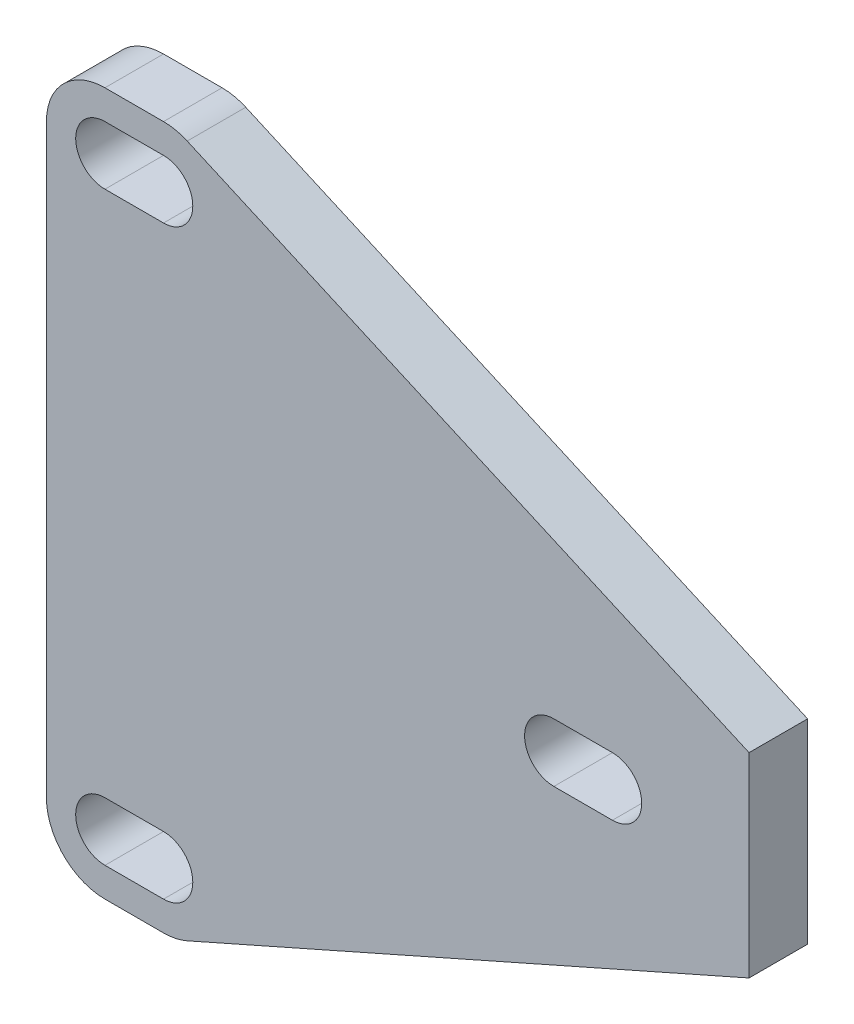
ISO-10303-21;
HEADER;
FILE_DESCRIPTION(('STEP AP214'),'2;1');
FILE_NAME('part.step','',(''),(''),'','','');
FILE_SCHEMA(('AUTOMOTIVE_DESIGN { 1 0 10303 214 1 1 1 1 }'));
ENDSEC;
DATA;
#1=APPLICATION_CONTEXT('core data for automotive mechanical design processes');
#2=APPLICATION_PROTOCOL_DEFINITION('international standard','automotive_design',2000,#1);
#3=PRODUCT_CONTEXT('',#1,'mechanical');
#4=PRODUCT('Part','Part','',(#3));
#5=PRODUCT_RELATED_PRODUCT_CATEGORY('part','',(#4));
#6=PRODUCT_DEFINITION_FORMATION('','',#4);
#7=PRODUCT_DEFINITION_CONTEXT('part definition',#1,'design');
#8=PRODUCT_DEFINITION('design','',#6,#7);
#9=PRODUCT_DEFINITION_SHAPE('','',#8);
#10=(LENGTH_UNIT() NAMED_UNIT(*) SI_UNIT(.MILLI.,.METRE.));
#11=(NAMED_UNIT(*) PLANE_ANGLE_UNIT() SI_UNIT($,.RADIAN.));
#12=(NAMED_UNIT(*) SI_UNIT($,.STERADIAN.) SOLID_ANGLE_UNIT());
#13=UNCERTAINTY_MEASURE_WITH_UNIT(LENGTH_MEASURE(1.E-05),#10,'distance_accuracy_value','');
#14=(GEOMETRIC_REPRESENTATION_CONTEXT(3) GLOBAL_UNCERTAINTY_ASSIGNED_CONTEXT((#13)) GLOBAL_UNIT_ASSIGNED_CONTEXT((#10,
#11,#12)) REPRESENTATION_CONTEXT('',''));
#15=CARTESIAN_POINT('',(0.,0.,0.));
#16=DIRECTION('',(0.,0.,1.));
#17=DIRECTION('',(1.,0.,0.));
#18=AXIS2_PLACEMENT_3D('',#15,#16,#17);
#19=CARTESIAN_POINT('',(-1.5,15.,3.));
#20=DIRECTION('',(0.,0.,1.));
#21=DIRECTION('',(1.,0.,0.));
#22=AXIS2_PLACEMENT_3D('',#19,#20,#21);
#23=PLANE('',#22);
#24=DIRECTION('',(1.,0.,0.));
#25=VECTOR('',#24,1.);
#26=CARTESIAN_POINT('',(1.5,13.5,3.));
#27=LINE('',#26,#25);
#28=CARTESIAN_POINT('',(-1.5,13.5,3.));
#29=VERTEX_POINT('',#28);
#30=CARTESIAN_POINT('',(1.5,13.5,3.));
#31=VERTEX_POINT('',#30);
#32=EDGE_CURVE('E262',#29,#31,#27,.T.);
#33=ORIENTED_EDGE('',*,*,#32,.F.);
#34=CARTESIAN_POINT('',(-1.5,15.,3.));
#35=DIRECTION('',(0.,0.,1.));
#36=DIRECTION('',(1.,0.,0.));
#37=AXIS2_PLACEMENT_3D('',#34,#35,#36);
#38=CIRCLE('',#37,1.5);
#39=CARTESIAN_POINT('',(-1.5,16.5,3.));
#40=VERTEX_POINT('',#39);
#41=EDGE_CURVE('E259',#40,#29,#38,.T.);
#42=ORIENTED_EDGE('',*,*,#41,.F.);
#43=DIRECTION('',(-1.,0.,0.));
#44=VECTOR('',#43,1.);
#45=CARTESIAN_POINT('',(-1.5,16.5,3.));
#46=LINE('',#45,#44);
#47=CARTESIAN_POINT('',(1.5,16.5,3.));
#48=VERTEX_POINT('',#47);
#49=EDGE_CURVE('E270',#48,#40,#46,.T.);
#50=ORIENTED_EDGE('',*,*,#49,.F.);
#51=CARTESIAN_POINT('',(1.5,15.,3.));
#52=DIRECTION('',(0.,0.,1.));
#53=DIRECTION('',(1.,0.,0.));
#54=AXIS2_PLACEMENT_3D('',#51,#52,#53);
#55=CIRCLE('',#54,1.5);
#56=EDGE_CURVE('E266',#31,#48,#55,.T.);
#57=ORIENTED_EDGE('',*,*,#56,.F.);
#58=EDGE_LOOP('',(#33,#42,#50,#57));
#59=FACE_BOUND('',#58,.T.);
#60=CARTESIAN_POINT('',(-1.5,15.,3.));
#61=DIRECTION('',(0.,0.,1.));
#62=DIRECTION('',(1.,0.,0.));
#63=AXIS2_PLACEMENT_3D('',#60,#61,#62);
#64=CIRCLE('',#63,3.);
#65=CARTESIAN_POINT('',(-1.50000000000001,18.,3.));
#66=VERTEX_POINT('',#65);
#67=CARTESIAN_POINT('',(-4.5,15.,3.));
#68=VERTEX_POINT('',#67);
#69=EDGE_CURVE('E341',#66,#68,#64,.T.);
#70=ORIENTED_EDGE('',*,*,#69,.T.);
#71=DIRECTION('',(0.,-1.,0.));
#72=VECTOR('',#71,1.);
#73=CARTESIAN_POINT('',(-4.5,15.,3.));
#74=LINE('',#73,#72);
#75=CARTESIAN_POINT('',(-4.5,-15.,3.));
#76=VERTEX_POINT('',#75);
#77=EDGE_CURVE('E345',#68,#76,#74,.T.);
#78=ORIENTED_EDGE('',*,*,#77,.T.);
#79=CARTESIAN_POINT('',(-1.5,-15.,3.));
#80=DIRECTION('',(0.,0.,1.));
#81=DIRECTION('',(-1.,0.,0.));
#82=AXIS2_PLACEMENT_3D('',#79,#80,#81);
#83=CIRCLE('',#82,3.);
#84=CARTESIAN_POINT('',(-1.50000000000001,-18.,3.));
#85=VERTEX_POINT('',#84);
#86=EDGE_CURVE('E348',#76,#85,#83,.T.);
#87=ORIENTED_EDGE('',*,*,#86,.T.);
#88=DIRECTION('',(1.,0.,0.));
#89=VECTOR('',#88,1.);
#90=CARTESIAN_POINT('',(-1.50000000000001,-18.,3.));
#91=LINE('',#90,#89);
#92=CARTESIAN_POINT('',(1.5,-18.,3.));
#93=VERTEX_POINT('',#92);
#94=EDGE_CURVE('E350',#85,#93,#91,.T.);
#95=ORIENTED_EDGE('',*,*,#94,.T.);
#96=CARTESIAN_POINT('',(1.5,-15.,3.));
#97=DIRECTION('',(0.,0.,1.));
#98=DIRECTION('',(-1.,0.,0.));
#99=AXIS2_PLACEMENT_3D('',#96,#97,#98);
#100=CIRCLE('',#99,3.);
#101=CARTESIAN_POINT('',(2.71440457432183,-17.7432137229655,3.));
#102=VERTEX_POINT('',#101);
#103=EDGE_CURVE('E352',#93,#102,#100,.T.);
#104=ORIENTED_EDGE('',*,*,#103,.T.);
#105=DIRECTION('',(0.914404574321832,0.404801524773944,0.));
#106=VECTOR('',#105,1.);
#107=CARTESIAN_POINT('',(31.5,-5.,3.));
#108=LINE('',#107,#106);
#109=CARTESIAN_POINT('',(31.5,-5.,3.));
#110=VERTEX_POINT('',#109);
#111=EDGE_CURVE('E354',#102,#110,#108,.T.);
#112=ORIENTED_EDGE('',*,*,#111,.T.);
#113=DIRECTION('',(0.,1.,0.));
#114=VECTOR('',#113,1.);
#115=CARTESIAN_POINT('',(31.5,-5.,3.));
#116=LINE('',#115,#114);
#117=CARTESIAN_POINT('',(31.5,5.,3.));
#118=VERTEX_POINT('',#117);
#119=EDGE_CURVE('E357',#110,#118,#116,.T.);
#120=ORIENTED_EDGE('',*,*,#119,.T.);
#121=DIRECTION('',(-0.914404574321832,0.404801524773944,0.));
#122=VECTOR('',#121,1.);
#123=CARTESIAN_POINT('',(31.5,5.,3.));
#124=LINE('',#123,#122);
#125=CARTESIAN_POINT('',(2.71440457432183,17.7432137229655,3.));
#126=VERTEX_POINT('',#125);
#127=EDGE_CURVE('E359',#118,#126,#124,.T.);
#128=ORIENTED_EDGE('',*,*,#127,.T.);
#129=CARTESIAN_POINT('',(1.5,15.,3.));
#130=DIRECTION('',(0.,0.,1.));
#131=DIRECTION('',(1.,0.,0.));
#132=AXIS2_PLACEMENT_3D('',#129,#130,#131);
#133=CIRCLE('',#132,3.);
#134=CARTESIAN_POINT('',(1.5,18.,3.));
#135=VERTEX_POINT('',#134);
#136=EDGE_CURVE('E362',#126,#135,#133,.T.);
#137=ORIENTED_EDGE('',*,*,#136,.T.);
#138=DIRECTION('',(-1.,0.,0.));
#139=VECTOR('',#138,1.);
#140=CARTESIAN_POINT('',(-1.50000000000001,18.,3.));
#141=LINE('',#140,#139);
#142=EDGE_CURVE('E365',#135,#66,#141,.T.);
#143=ORIENTED_EDGE('',*,*,#142,.T.);
#144=EDGE_LOOP('',(#70,#78,#87,#95,#104,#112,#120,#128,#137,#143));
#145=FACE_BOUND('',#144,.T.);
#146=DIRECTION('',(1.,0.,0.));
#147=VECTOR('',#146,1.);
#148=CARTESIAN_POINT('',(21.5,-1.5,3.));
#149=LINE('',#148,#147);
#150=CARTESIAN_POINT('',(21.5,-1.5,3.));
#151=VERTEX_POINT('',#150);
#152=CARTESIAN_POINT('',(24.5,-1.5,3.));
#153=VERTEX_POINT('',#152);
#154=EDGE_CURVE('E304',#151,#153,#149,.T.);
#155=ORIENTED_EDGE('',*,*,#154,.F.);
#156=CARTESIAN_POINT('',(21.5,0.,3.));
#157=DIRECTION('',(0.,0.,1.));
#158=DIRECTION('',(1.,0.,0.));
#159=AXIS2_PLACEMENT_3D('',#156,#157,#158);
#160=CIRCLE('',#159,1.5);
#161=CARTESIAN_POINT('',(21.5,1.5,3.));
#162=VERTEX_POINT('',#161);
#163=EDGE_CURVE('E302',#162,#151,#160,.T.);
#164=ORIENTED_EDGE('',*,*,#163,.F.);
#165=DIRECTION('',(-1.,0.,0.));
#166=VECTOR('',#165,1.);
#167=CARTESIAN_POINT('',(21.5,1.5,3.));
#168=LINE('',#167,#166);
#169=CARTESIAN_POINT('',(24.5,1.5,3.));
#170=VERTEX_POINT('',#169);
#171=EDGE_CURVE('E310',#170,#162,#168,.T.);
#172=ORIENTED_EDGE('',*,*,#171,.F.);
#173=CARTESIAN_POINT('',(24.5,0.,3.));
#174=DIRECTION('',(0.,0.,1.));
#175=DIRECTION('',(1.,0.,0.));
#176=AXIS2_PLACEMENT_3D('',#173,#174,#175);
#177=CIRCLE('',#176,1.5);
#178=EDGE_CURVE('E307',#153,#170,#177,.T.);
#179=ORIENTED_EDGE('',*,*,#178,.F.);
#180=EDGE_LOOP('',(#155,#164,#172,#179));
#181=FACE_BOUND('',#180,.T.);
#182=DIRECTION('',(-1.,0.,0.));
#183=VECTOR('',#182,1.);
#184=CARTESIAN_POINT('',(1.5,-13.5,3.));
#185=LINE('',#184,#183);
#186=CARTESIAN_POINT('',(1.5,-13.5,3.));
#187=VERTEX_POINT('',#186);
#188=CARTESIAN_POINT('',(-1.5,-13.5,3.));
#189=VERTEX_POINT('',#188);
#190=EDGE_CURVE('E223',#187,#189,#185,.T.);
#191=ORIENTED_EDGE('',*,*,#190,.F.);
#192=CARTESIAN_POINT('',(1.5,-15.,3.));
#193=DIRECTION('',(0.,0.,1.));
#194=DIRECTION('',(-1.,0.,0.));
#195=AXIS2_PLACEMENT_3D('',#192,#193,#194);
#196=CIRCLE('',#195,1.5);
#197=CARTESIAN_POINT('',(1.5,-16.5,3.));
#198=VERTEX_POINT('',#197);
#199=EDGE_CURVE('E215',#198,#187,#196,.T.);
#200=ORIENTED_EDGE('',*,*,#199,.F.);
#201=DIRECTION('',(1.,0.,0.));
#202=VECTOR('',#201,1.);
#203=CARTESIAN_POINT('',(-1.5,-16.5,3.));
#204=LINE('',#203,#202);
#205=CARTESIAN_POINT('',(-1.5,-16.5,3.));
#206=VERTEX_POINT('',#205);
#207=EDGE_CURVE('E238',#206,#198,#204,.T.);
#208=ORIENTED_EDGE('',*,*,#207,.F.);
#209=CARTESIAN_POINT('',(-1.5,-15.,3.));
#210=DIRECTION('',(0.,0.,1.));
#211=DIRECTION('',(-1.,0.,0.));
#212=AXIS2_PLACEMENT_3D('',#209,#210,#211);
#213=CIRCLE('',#212,1.5);
#214=EDGE_CURVE('E236',#189,#206,#213,.T.);
#215=ORIENTED_EDGE('',*,*,#214,.F.);
#216=EDGE_LOOP('',(#191,#200,#208,#215));
#217=FACE_BOUND('',#216,.T.);
#218=ADVANCED_FACE('F42',(#59,#145,#181,#217),#23,.T.);
#219=CARTESIAN_POINT('',(-1.5,15.,0.));
#220=DIRECTION('',(0.,0.,1.));
#221=DIRECTION('',(1.,0.,0.));
#222=AXIS2_PLACEMENT_3D('',#219,#220,#221);
#223=PLANE('',#222);
#224=CARTESIAN_POINT('',(-1.5,15.,0.));
#225=DIRECTION('',(0.,0.,1.));
#226=DIRECTION('',(1.,0.,0.));
#227=AXIS2_PLACEMENT_3D('',#224,#225,#226);
#228=CIRCLE('',#227,1.5);
#229=CARTESIAN_POINT('',(-1.5,16.5,0.));
#230=VERTEX_POINT('',#229);
#231=CARTESIAN_POINT('',(-1.5,13.5,0.));
#232=VERTEX_POINT('',#231);
#233=EDGE_CURVE('E232',#230,#232,#228,.T.);
#234=ORIENTED_EDGE('',*,*,#233,.T.);
#235=DIRECTION('',(1.,0.,0.));
#236=VECTOR('',#235,1.);
#237=CARTESIAN_POINT('',(1.5,13.5,0.));
#238=LINE('',#237,#236);
#239=CARTESIAN_POINT('',(1.5,13.5,0.));
#240=VERTEX_POINT('',#239);
#241=EDGE_CURVE('E277',#232,#240,#238,.T.);
#242=ORIENTED_EDGE('',*,*,#241,.T.);
#243=CARTESIAN_POINT('',(1.5,15.,0.));
#244=DIRECTION('',(0.,0.,1.));
#245=DIRECTION('',(1.,0.,0.));
#246=AXIS2_PLACEMENT_3D('',#243,#244,#245);
#247=CIRCLE('',#246,1.5);
#248=CARTESIAN_POINT('',(1.5,16.5,0.));
#249=VERTEX_POINT('',#248);
#250=EDGE_CURVE('E281',#240,#249,#247,.T.);
#251=ORIENTED_EDGE('',*,*,#250,.T.);
#252=DIRECTION('',(-1.,0.,0.));
#253=VECTOR('',#252,1.);
#254=CARTESIAN_POINT('',(-1.5,16.5,0.));
#255=LINE('',#254,#253);
#256=EDGE_CURVE('E263',#249,#230,#255,.T.);
#257=ORIENTED_EDGE('',*,*,#256,.T.);
#258=EDGE_LOOP('',(#234,#242,#251,#257));
#259=FACE_BOUND('',#258,.T.);
#260=CARTESIAN_POINT('',(-1.5,15.,0.));
#261=DIRECTION('',(0.,0.,1.));
#262=DIRECTION('',(1.,0.,0.));
#263=AXIS2_PLACEMENT_3D('',#260,#261,#262);
#264=CIRCLE('',#263,3.);
#265=CARTESIAN_POINT('',(-1.50000000000001,18.,0.));
#266=VERTEX_POINT('',#265);
#267=CARTESIAN_POINT('',(-4.5,15.,0.));
#268=VERTEX_POINT('',#267);
#269=EDGE_CURVE('E340',#266,#268,#264,.T.);
#270=ORIENTED_EDGE('',*,*,#269,.F.);
#271=DIRECTION('',(-1.,0.,0.));
#272=VECTOR('',#271,1.);
#273=CARTESIAN_POINT('',(-1.50000000000001,18.,0.));
#274=LINE('',#273,#272);
#275=CARTESIAN_POINT('',(1.5,18.,0.));
#276=VERTEX_POINT('',#275);
#277=EDGE_CURVE('E346',#276,#266,#274,.T.);
#278=ORIENTED_EDGE('',*,*,#277,.F.);
#279=CARTESIAN_POINT('',(1.5,15.,0.));
#280=DIRECTION('',(0.,0.,1.));
#281=DIRECTION('',(1.,0.,0.));
#282=AXIS2_PLACEMENT_3D('',#279,#280,#281);
#283=CIRCLE('',#282,3.);
#284=CARTESIAN_POINT('',(2.71440457432183,17.7432137229655,0.));
#285=VERTEX_POINT('',#284);
#286=EDGE_CURVE('E391',#285,#276,#283,.T.);
#287=ORIENTED_EDGE('',*,*,#286,.F.);
#288=DIRECTION('',(-0.914404574321832,0.404801524773944,0.));
#289=VECTOR('',#288,1.);
#290=CARTESIAN_POINT('',(31.5,5.,0.));
#291=LINE('',#290,#289);
#292=CARTESIAN_POINT('',(31.5,5.,0.));
#293=VERTEX_POINT('',#292);
#294=EDGE_CURVE('E388',#293,#285,#291,.T.);
#295=ORIENTED_EDGE('',*,*,#294,.F.);
#296=DIRECTION('',(0.,1.,0.));
#297=VECTOR('',#296,1.);
#298=CARTESIAN_POINT('',(31.5,-5.,0.));
#299=LINE('',#298,#297);
#300=CARTESIAN_POINT('',(31.5,-5.,0.));
#301=VERTEX_POINT('',#300);
#302=EDGE_CURVE('E386',#301,#293,#299,.T.);
#303=ORIENTED_EDGE('',*,*,#302,.F.);
#304=DIRECTION('',(0.914404574321832,0.404801524773944,0.));
#305=VECTOR('',#304,1.);
#306=CARTESIAN_POINT('',(31.5,-5.,0.));
#307=LINE('',#306,#305);
#308=CARTESIAN_POINT('',(2.71440457432183,-17.7432137229655,0.));
#309=VERTEX_POINT('',#308);
#310=EDGE_CURVE('E383',#309,#301,#307,.T.);
#311=ORIENTED_EDGE('',*,*,#310,.F.);
#312=CARTESIAN_POINT('',(1.5,-15.,0.));
#313=DIRECTION('',(0.,0.,1.));
#314=DIRECTION('',(-1.,0.,0.));
#315=AXIS2_PLACEMENT_3D('',#312,#313,#314);
#316=CIRCLE('',#315,3.);
#317=CARTESIAN_POINT('',(1.5,-18.,0.));
#318=VERTEX_POINT('',#317);
#319=EDGE_CURVE('E380',#318,#309,#316,.T.);
#320=ORIENTED_EDGE('',*,*,#319,.F.);
#321=DIRECTION('',(1.,0.,0.));
#322=VECTOR('',#321,1.);
#323=CARTESIAN_POINT('',(-1.50000000000001,-18.,0.));
#324=LINE('',#323,#322);
#325=CARTESIAN_POINT('',(-1.50000000000001,-18.,0.));
#326=VERTEX_POINT('',#325);
#327=EDGE_CURVE('E377',#326,#318,#324,.T.);
#328=ORIENTED_EDGE('',*,*,#327,.F.);
#329=CARTESIAN_POINT('',(-1.5,-15.,0.));
#330=DIRECTION('',(0.,0.,1.));
#331=DIRECTION('',(-1.,0.,0.));
#332=AXIS2_PLACEMENT_3D('',#329,#330,#331);
#333=CIRCLE('',#332,3.);
#334=CARTESIAN_POINT('',(-4.5,-15.,0.));
#335=VERTEX_POINT('',#334);
#336=EDGE_CURVE('E374',#335,#326,#333,.T.);
#337=ORIENTED_EDGE('',*,*,#336,.F.);
#338=DIRECTION('',(0.,-1.,0.));
#339=VECTOR('',#338,1.);
#340=CARTESIAN_POINT('',(-4.5,15.,0.));
#341=LINE('',#340,#339);
#342=EDGE_CURVE('E372',#268,#335,#341,.T.);
#343=ORIENTED_EDGE('',*,*,#342,.F.);
#344=EDGE_LOOP('',(#270,#278,#287,#295,#303,#311,#320,#328,#337,#343));
#345=FACE_BOUND('',#344,.T.);
#346=CARTESIAN_POINT('',(21.5,0.,0.));
#347=DIRECTION('',(0.,0.,1.));
#348=DIRECTION('',(1.,0.,0.));
#349=AXIS2_PLACEMENT_3D('',#346,#347,#348);
#350=CIRCLE('',#349,1.5);
#351=CARTESIAN_POINT('',(21.5,1.5,0.));
#352=VERTEX_POINT('',#351);
#353=CARTESIAN_POINT('',(21.5,-1.5,0.));
#354=VERTEX_POINT('',#353);
#355=EDGE_CURVE('E301',#352,#354,#350,.T.);
#356=ORIENTED_EDGE('',*,*,#355,.T.);
#357=DIRECTION('',(1.,0.,0.));
#358=VECTOR('',#357,1.);
#359=CARTESIAN_POINT('',(21.5,-1.5,0.));
#360=LINE('',#359,#358);
#361=CARTESIAN_POINT('',(24.5,-1.5,0.));
#362=VERTEX_POINT('',#361);
#363=EDGE_CURVE('E316',#354,#362,#360,.T.);
#364=ORIENTED_EDGE('',*,*,#363,.T.);
#365=CARTESIAN_POINT('',(24.5,0.,0.));
#366=DIRECTION('',(0.,0.,1.));
#367=DIRECTION('',(1.,0.,0.));
#368=AXIS2_PLACEMENT_3D('',#365,#366,#367);
#369=CIRCLE('',#368,1.5);
#370=CARTESIAN_POINT('',(24.5,1.5,0.));
#371=VERTEX_POINT('',#370);
#372=EDGE_CURVE('E320',#362,#371,#369,.T.);
#373=ORIENTED_EDGE('',*,*,#372,.T.);
#374=DIRECTION('',(-1.,0.,0.));
#375=VECTOR('',#374,1.);
#376=CARTESIAN_POINT('',(21.5,1.5,0.));
#377=LINE('',#376,#375);
#378=EDGE_CURVE('E305',#371,#352,#377,.T.);
#379=ORIENTED_EDGE('',*,*,#378,.T.);
#380=EDGE_LOOP('',(#356,#364,#373,#379));
#381=FACE_BOUND('',#380,.T.);
#382=CARTESIAN_POINT('',(1.5,-15.,0.));
#383=DIRECTION('',(0.,0.,1.));
#384=DIRECTION('',(-1.,0.,0.));
#385=AXIS2_PLACEMENT_3D('',#382,#383,#384);
#386=CIRCLE('',#385,1.5);
#387=CARTESIAN_POINT('',(1.5,-16.5,0.));
#388=VERTEX_POINT('',#387);
#389=CARTESIAN_POINT('',(1.5,-13.5,0.));
#390=VERTEX_POINT('',#389);
#391=EDGE_CURVE('E68',#388,#390,#386,.T.);
#392=ORIENTED_EDGE('',*,*,#391,.T.);
#393=DIRECTION('',(-1.,0.,0.));
#394=VECTOR('',#393,1.);
#395=CARTESIAN_POINT('',(1.5,-13.5,0.));
#396=LINE('',#395,#394);
#397=CARTESIAN_POINT('',(-1.5,-13.5,0.));
#398=VERTEX_POINT('',#397);
#399=EDGE_CURVE('E230',#390,#398,#396,.T.);
#400=ORIENTED_EDGE('',*,*,#399,.T.);
#401=CARTESIAN_POINT('',(-1.5,-15.,0.));
#402=DIRECTION('',(0.,0.,1.));
#403=DIRECTION('',(-1.,0.,0.));
#404=AXIS2_PLACEMENT_3D('',#401,#402,#403);
#405=CIRCLE('',#404,1.5);
#406=CARTESIAN_POINT('',(-1.5,-16.5,0.));
#407=VERTEX_POINT('',#406);
#408=EDGE_CURVE('E246',#398,#407,#405,.T.);
#409=ORIENTED_EDGE('',*,*,#408,.T.);
#410=DIRECTION('',(1.,0.,0.));
#411=VECTOR('',#410,1.);
#412=CARTESIAN_POINT('',(-1.5,-16.5,0.));
#413=LINE('',#412,#411);
#414=EDGE_CURVE('E224',#407,#388,#413,.T.);
#415=ORIENTED_EDGE('',*,*,#414,.T.);
#416=EDGE_LOOP('',(#392,#400,#409,#415));
#417=FACE_BOUND('',#416,.T.);
#418=ADVANCED_FACE('F435',(#259,#345,#381,#417),#223,.F.);
#419=CARTESIAN_POINT('',(-1.5,15.,3.));
#420=DIRECTION('',(0.,0.,-1.));
#421=DIRECTION('',(-1.,0.,0.));
#422=AXIS2_PLACEMENT_3D('',#419,#420,#421);
#423=CYLINDRICAL_SURFACE('',#422,3.);
#424=ORIENTED_EDGE('',*,*,#269,.T.);
#425=DIRECTION('',(0.,0.,-1.));
#426=VECTOR('',#425,1.);
#427=CARTESIAN_POINT('',(-4.5,15.,3.));
#428=LINE('',#427,#426);
#429=EDGE_CURVE('E11',#68,#268,#428,.T.);
#430=ORIENTED_EDGE('',*,*,#429,.F.);
#431=ORIENTED_EDGE('',*,*,#69,.F.);
#432=DIRECTION('',(0.,0.,-1.));
#433=VECTOR('',#432,1.);
#434=CARTESIAN_POINT('',(-1.50000000000001,18.,3.));
#435=LINE('',#434,#433);
#436=EDGE_CURVE('E368',#66,#266,#435,.T.);
#437=ORIENTED_EDGE('',*,*,#436,.T.);
#438=EDGE_LOOP('',(#424,#430,#431,#437));
#439=FACE_BOUND('',#438,.T.);
#440=ADVANCED_FACE('F44',(#439),#423,.T.);
#441=CARTESIAN_POINT('',(-4.5,15.,3.));
#442=DIRECTION('',(1.,0.,0.));
#443=DIRECTION('',(0.,0.,-1.));
#444=AXIS2_PLACEMENT_3D('',#441,#442,#443);
#445=PLANE('',#444);
#446=ORIENTED_EDGE('',*,*,#342,.T.);
#447=DIRECTION('',(0.,0.,-1.));
#448=VECTOR('',#447,1.);
#449=CARTESIAN_POINT('',(-4.5,-15.,3.));
#450=LINE('',#449,#448);
#451=EDGE_CURVE('E50',#76,#335,#450,.T.);
#452=ORIENTED_EDGE('',*,*,#451,.F.);
#453=ORIENTED_EDGE('',*,*,#77,.F.);
#454=ORIENTED_EDGE('',*,*,#429,.T.);
#455=EDGE_LOOP('',(#446,#452,#453,#454));
#456=FACE_BOUND('',#455,.T.);
#457=ADVANCED_FACE('F453',(#456),#445,.F.);
#458=CARTESIAN_POINT('',(-1.5,-15.,3.));
#459=DIRECTION('',(0.,0.,-1.));
#460=DIRECTION('',(-1.,0.,0.));
#461=AXIS2_PLACEMENT_3D('',#458,#459,#460);
#462=CYLINDRICAL_SURFACE('',#461,3.);
#463=ORIENTED_EDGE('',*,*,#336,.T.);
#464=DIRECTION('',(0.,0.,-1.));
#465=VECTOR('',#464,1.);
#466=CARTESIAN_POINT('',(-1.50000000000001,-18.,3.));
#467=LINE('',#466,#465);
#468=EDGE_CURVE('E421',#85,#326,#467,.T.);
#469=ORIENTED_EDGE('',*,*,#468,.F.);
#470=ORIENTED_EDGE('',*,*,#86,.F.);
#471=ORIENTED_EDGE('',*,*,#451,.T.);
#472=EDGE_LOOP('',(#463,#469,#470,#471));
#473=FACE_BOUND('',#472,.T.);
#474=ADVANCED_FACE('F429',(#473),#462,.T.);
#475=CARTESIAN_POINT('',(-1.50000000000001,-18.,3.));
#476=DIRECTION('',(0.,1.,0.));
#477=DIRECTION('',(0.,0.,1.));
#478=AXIS2_PLACEMENT_3D('',#475,#476,#477);
#479=PLANE('',#478);
#480=ORIENTED_EDGE('',*,*,#327,.T.);
#481=DIRECTION('',(0.,0.,-1.));
#482=VECTOR('',#481,1.);
#483=CARTESIAN_POINT('',(1.5,-18.,3.));
#484=LINE('',#483,#482);
#485=EDGE_CURVE('E417',#93,#318,#484,.T.);
#486=ORIENTED_EDGE('',*,*,#485,.F.);
#487=ORIENTED_EDGE('',*,*,#94,.F.);
#488=ORIENTED_EDGE('',*,*,#468,.T.);
#489=EDGE_LOOP('',(#480,#486,#487,#488));
#490=FACE_BOUND('',#489,.T.);
#491=ADVANCED_FACE('F441',(#490),#479,.F.);
#492=CARTESIAN_POINT('',(1.5,-15.,3.));
#493=DIRECTION('',(0.,0.,-1.));
#494=DIRECTION('',(-1.,0.,0.));
#495=AXIS2_PLACEMENT_3D('',#492,#493,#494);
#496=CYLINDRICAL_SURFACE('',#495,3.);
#497=ORIENTED_EDGE('',*,*,#319,.T.);
#498=DIRECTION('',(0.,0.,-1.));
#499=VECTOR('',#498,1.);
#500=CARTESIAN_POINT('',(2.71440457432183,-17.7432137229655,3.));
#501=LINE('',#500,#499);
#502=EDGE_CURVE('E413',#102,#309,#501,.T.);
#503=ORIENTED_EDGE('',*,*,#502,.F.);
#504=ORIENTED_EDGE('',*,*,#103,.F.);
#505=ORIENTED_EDGE('',*,*,#485,.T.);
#506=EDGE_LOOP('',(#497,#503,#504,#505));
#507=FACE_BOUND('',#506,.T.);
#508=ADVANCED_FACE('F445',(#507),#496,.T.);
#509=CARTESIAN_POINT('',(31.5,-5.,3.));
#510=DIRECTION('',(-0.404801524773944,0.914404574321832,0.));
#511=DIRECTION('',(-0.914404574321832,-0.404801524773944,0.));
#512=AXIS2_PLACEMENT_3D('',#509,#510,#511);
#513=PLANE('',#512);
#514=ORIENTED_EDGE('',*,*,#310,.T.);
#515=DIRECTION('',(0.,0.,-1.));
#516=VECTOR('',#515,1.);
#517=CARTESIAN_POINT('',(31.5,-5.,3.));
#518=LINE('',#517,#516);
#519=EDGE_CURVE('E410',#110,#301,#518,.T.);
#520=ORIENTED_EDGE('',*,*,#519,.F.);
#521=ORIENTED_EDGE('',*,*,#111,.F.);
#522=ORIENTED_EDGE('',*,*,#502,.T.);
#523=EDGE_LOOP('',(#514,#520,#521,#522));
#524=FACE_BOUND('',#523,.T.);
#525=ADVANCED_FACE('F476',(#524),#513,.F.);
#526=CARTESIAN_POINT('',(31.5,-5.,3.));
#527=DIRECTION('',(-1.,0.,0.));
#528=DIRECTION('',(0.,0.,1.));
#529=AXIS2_PLACEMENT_3D('',#526,#527,#528);
#530=PLANE('',#529);
#531=ORIENTED_EDGE('',*,*,#302,.T.);
#532=DIRECTION('',(0.,0.,-1.));
#533=VECTOR('',#532,1.);
#534=CARTESIAN_POINT('',(31.5,5.,3.));
#535=LINE('',#534,#533);
#536=EDGE_CURVE('E407',#118,#293,#535,.T.);
#537=ORIENTED_EDGE('',*,*,#536,.F.);
#538=ORIENTED_EDGE('',*,*,#119,.F.);
#539=ORIENTED_EDGE('',*,*,#519,.T.);
#540=EDGE_LOOP('',(#531,#537,#538,#539));
#541=FACE_BOUND('',#540,.T.);
#542=ADVANCED_FACE('F473',(#541),#530,.F.);
#543=CARTESIAN_POINT('',(31.5,5.,3.));
#544=DIRECTION('',(-0.404801524773944,-0.914404574321832,0.));
#545=DIRECTION('',(0.914404574321832,-0.404801524773944,0.));
#546=AXIS2_PLACEMENT_3D('',#543,#544,#545);
#547=PLANE('',#546);
#548=ORIENTED_EDGE('',*,*,#294,.T.);
#549=DIRECTION('',(0.,0.,-1.));
#550=VECTOR('',#549,1.);
#551=CARTESIAN_POINT('',(2.71440457432183,17.7432137229655,3.));
#552=LINE('',#551,#550);
#553=EDGE_CURVE('E403',#126,#285,#552,.T.);
#554=ORIENTED_EDGE('',*,*,#553,.F.);
#555=ORIENTED_EDGE('',*,*,#127,.F.);
#556=ORIENTED_EDGE('',*,*,#536,.T.);
#557=EDGE_LOOP('',(#548,#554,#555,#556));
#558=FACE_BOUND('',#557,.T.);
#559=ADVANCED_FACE('F469',(#558),#547,.F.);
#560=CARTESIAN_POINT('',(1.5,15.,3.));
#561=DIRECTION('',(0.,0.,-1.));
#562=DIRECTION('',(-1.,0.,0.));
#563=AXIS2_PLACEMENT_3D('',#560,#561,#562);
#564=CYLINDRICAL_SURFACE('',#563,3.);
#565=ORIENTED_EDGE('',*,*,#286,.T.);
#566=DIRECTION('',(0.,0.,-1.));
#567=VECTOR('',#566,1.);
#568=CARTESIAN_POINT('',(1.5,18.,3.));
#569=LINE('',#568,#567);
#570=EDGE_CURVE('E399',#135,#276,#569,.T.);
#571=ORIENTED_EDGE('',*,*,#570,.F.);
#572=ORIENTED_EDGE('',*,*,#136,.F.);
#573=ORIENTED_EDGE('',*,*,#553,.T.);
#574=EDGE_LOOP('',(#565,#571,#572,#573));
#575=FACE_BOUND('',#574,.T.);
#576=ADVANCED_FACE('F465',(#575),#564,.T.);
#577=CARTESIAN_POINT('',(-1.50000000000001,18.,3.));
#578=DIRECTION('',(0.,-1.,0.));
#579=DIRECTION('',(0.,0.,-1.));
#580=AXIS2_PLACEMENT_3D('',#577,#578,#579);
#581=PLANE('',#580);
#582=ORIENTED_EDGE('',*,*,#277,.T.);
#583=ORIENTED_EDGE('',*,*,#436,.F.);
#584=ORIENTED_EDGE('',*,*,#142,.F.);
#585=ORIENTED_EDGE('',*,*,#570,.T.);
#586=EDGE_LOOP('',(#582,#583,#584,#585));
#587=FACE_BOUND('',#586,.T.);
#588=ADVANCED_FACE('F460',(#587),#581,.F.);
#589=CARTESIAN_POINT('',(21.5,0.,3.));
#590=DIRECTION('',(0.,0.,-1.));
#591=DIRECTION('',(-1.,0.,0.));
#592=AXIS2_PLACEMENT_3D('',#589,#590,#591);
#593=CYLINDRICAL_SURFACE('',#592,1.5);
#594=ORIENTED_EDGE('',*,*,#355,.F.);
#595=DIRECTION('',(0.,0.,-1.));
#596=VECTOR('',#595,1.);
#597=CARTESIAN_POINT('',(21.5,1.5,3.));
#598=LINE('',#597,#596);
#599=EDGE_CURVE('E312',#162,#352,#598,.T.);
#600=ORIENTED_EDGE('',*,*,#599,.F.);
#601=ORIENTED_EDGE('',*,*,#163,.T.);
#602=DIRECTION('',(0.,0.,-1.));
#603=VECTOR('',#602,1.);
#604=CARTESIAN_POINT('',(21.5,-1.5,3.));
#605=LINE('',#604,#603);
#606=EDGE_CURVE('E336',#151,#354,#605,.T.);
#607=ORIENTED_EDGE('',*,*,#606,.T.);
#608=EDGE_LOOP('',(#594,#600,#601,#607));
#609=FACE_BOUND('',#608,.T.);
#610=ADVANCED_FACE('F495',(#609),#593,.F.);
#611=CARTESIAN_POINT('',(21.5,-1.5,3.));
#612=DIRECTION('',(0.,1.,0.));
#613=DIRECTION('',(0.,0.,1.));
#614=AXIS2_PLACEMENT_3D('',#611,#612,#613);
#615=PLANE('',#614);
#616=ORIENTED_EDGE('',*,*,#363,.F.);
#617=ORIENTED_EDGE('',*,*,#606,.F.);
#618=ORIENTED_EDGE('',*,*,#154,.T.);
#619=DIRECTION('',(0.,0.,-1.));
#620=VECTOR('',#619,1.);
#621=CARTESIAN_POINT('',(24.5,-1.5,3.));
#622=LINE('',#621,#620);
#623=EDGE_CURVE('E333',#153,#362,#622,.T.);
#624=ORIENTED_EDGE('',*,*,#623,.T.);
#625=EDGE_LOOP('',(#616,#617,#618,#624));
#626=FACE_BOUND('',#625,.T.);
#627=ADVANCED_FACE('F520',(#626),#615,.T.);
#628=CARTESIAN_POINT('',(24.5,0.,3.));
#629=DIRECTION('',(0.,0.,-1.));
#630=DIRECTION('',(-1.,0.,0.));
#631=AXIS2_PLACEMENT_3D('',#628,#629,#630);
#632=CYLINDRICAL_SURFACE('',#631,1.5);
#633=ORIENTED_EDGE('',*,*,#372,.F.);
#634=ORIENTED_EDGE('',*,*,#623,.F.);
#635=ORIENTED_EDGE('',*,*,#178,.T.);
#636=DIRECTION('',(0.,0.,-1.));
#637=VECTOR('',#636,1.);
#638=CARTESIAN_POINT('',(24.5,1.5,3.));
#639=LINE('',#638,#637);
#640=EDGE_CURVE('E330',#170,#371,#639,.T.);
#641=ORIENTED_EDGE('',*,*,#640,.T.);
#642=EDGE_LOOP('',(#633,#634,#635,#641));
#643=FACE_BOUND('',#642,.T.);
#644=ADVANCED_FACE('F527',(#643),#632,.F.);
#645=CARTESIAN_POINT('',(21.5,1.5,3.));
#646=DIRECTION('',(0.,-1.,0.));
#647=DIRECTION('',(0.,0.,-1.));
#648=AXIS2_PLACEMENT_3D('',#645,#646,#647);
#649=PLANE('',#648);
#650=ORIENTED_EDGE('',*,*,#378,.F.);
#651=ORIENTED_EDGE('',*,*,#640,.F.);
#652=ORIENTED_EDGE('',*,*,#171,.T.);
#653=ORIENTED_EDGE('',*,*,#599,.T.);
#654=EDGE_LOOP('',(#650,#651,#652,#653));
#655=FACE_BOUND('',#654,.T.);
#656=ADVANCED_FACE('F534',(#655),#649,.T.);
#657=CARTESIAN_POINT('',(-1.5,15.,3.));
#658=DIRECTION('',(0.,0.,-1.));
#659=DIRECTION('',(-1.,0.,0.));
#660=AXIS2_PLACEMENT_3D('',#657,#658,#659);
#661=CYLINDRICAL_SURFACE('',#660,1.5);
#662=ORIENTED_EDGE('',*,*,#233,.F.);
#663=DIRECTION('',(0.,0.,-1.));
#664=VECTOR('',#663,1.);
#665=CARTESIAN_POINT('',(-1.5,16.5,3.));
#666=LINE('',#665,#664);
#667=EDGE_CURVE('E273',#40,#230,#666,.T.);
#668=ORIENTED_EDGE('',*,*,#667,.F.);
#669=ORIENTED_EDGE('',*,*,#41,.T.);
#670=DIRECTION('',(0.,0.,-1.));
#671=VECTOR('',#670,1.);
#672=CARTESIAN_POINT('',(-1.5,13.5,3.));
#673=LINE('',#672,#671);
#674=EDGE_CURVE('E297',#29,#232,#673,.T.);
#675=ORIENTED_EDGE('',*,*,#674,.T.);
#676=EDGE_LOOP('',(#662,#668,#669,#675));
#677=FACE_BOUND('',#676,.T.);
#678=ADVANCED_FACE('F542',(#677),#661,.F.);
#679=CARTESIAN_POINT('',(1.5,13.5,3.));
#680=DIRECTION('',(0.,1.,0.));
#681=DIRECTION('',(0.,0.,1.));
#682=AXIS2_PLACEMENT_3D('',#679,#680,#681);
#683=PLANE('',#682);
#684=ORIENTED_EDGE('',*,*,#241,.F.);
#685=ORIENTED_EDGE('',*,*,#674,.F.);
#686=ORIENTED_EDGE('',*,*,#32,.T.);
#687=DIRECTION('',(0.,0.,-1.));
#688=VECTOR('',#687,1.);
#689=CARTESIAN_POINT('',(1.5,13.5,3.));
#690=LINE('',#689,#688);
#691=EDGE_CURVE('E294',#31,#240,#690,.T.);
#692=ORIENTED_EDGE('',*,*,#691,.T.);
#693=EDGE_LOOP('',(#684,#685,#686,#692));
#694=FACE_BOUND('',#693,.T.);
#695=ADVANCED_FACE('F550',(#694),#683,.T.);
#696=CARTESIAN_POINT('',(1.5,15.,3.));
#697=DIRECTION('',(0.,0.,-1.));
#698=DIRECTION('',(-1.,0.,0.));
#699=AXIS2_PLACEMENT_3D('',#696,#697,#698);
#700=CYLINDRICAL_SURFACE('',#699,1.5);
#701=ORIENTED_EDGE('',*,*,#250,.F.);
#702=ORIENTED_EDGE('',*,*,#691,.F.);
#703=ORIENTED_EDGE('',*,*,#56,.T.);
#704=DIRECTION('',(0.,0.,-1.));
#705=VECTOR('',#704,1.);
#706=CARTESIAN_POINT('',(1.5,16.5,3.));
#707=LINE('',#706,#705);
#708=EDGE_CURVE('E291',#48,#249,#707,.T.);
#709=ORIENTED_EDGE('',*,*,#708,.T.);
#710=EDGE_LOOP('',(#701,#702,#703,#709));
#711=FACE_BOUND('',#710,.T.);
#712=ADVANCED_FACE('F558',(#711),#700,.F.);
#713=CARTESIAN_POINT('',(-1.5,16.5,3.));
#714=DIRECTION('',(0.,-1.,0.));
#715=DIRECTION('',(0.,0.,-1.));
#716=AXIS2_PLACEMENT_3D('',#713,#714,#715);
#717=PLANE('',#716);
#718=ORIENTED_EDGE('',*,*,#256,.F.);
#719=ORIENTED_EDGE('',*,*,#708,.F.);
#720=ORIENTED_EDGE('',*,*,#49,.T.);
#721=ORIENTED_EDGE('',*,*,#667,.T.);
#722=EDGE_LOOP('',(#718,#719,#720,#721));
#723=FACE_BOUND('',#722,.T.);
#724=ADVANCED_FACE('F566',(#723),#717,.T.);
#725=CARTESIAN_POINT('',(1.5,-15.,3.));
#726=DIRECTION('',(0.,0.,-1.));
#727=DIRECTION('',(-1.,0.,0.));
#728=AXIS2_PLACEMENT_3D('',#725,#726,#727);
#729=CYLINDRICAL_SURFACE('',#728,1.5);
#730=ORIENTED_EDGE('',*,*,#391,.F.);
#731=DIRECTION('',(0.,0.,-1.));
#732=VECTOR('',#731,1.);
#733=CARTESIAN_POINT('',(1.5,-16.5,3.));
#734=LINE('',#733,#732);
#735=EDGE_CURVE('E219',#198,#388,#734,.T.);
#736=ORIENTED_EDGE('',*,*,#735,.F.);
#737=ORIENTED_EDGE('',*,*,#199,.T.);
#738=DIRECTION('',(0.,0.,-1.));
#739=VECTOR('',#738,1.);
#740=CARTESIAN_POINT('',(1.5,-13.5,3.));
#741=LINE('',#740,#739);
#742=EDGE_CURVE('E218',#187,#390,#741,.T.);
#743=ORIENTED_EDGE('',*,*,#742,.T.);
#744=EDGE_LOOP('',(#730,#736,#737,#743));
#745=FACE_BOUND('',#744,.T.);
#746=ADVANCED_FACE('F217',(#745),#729,.F.);
#747=CARTESIAN_POINT('',(1.5,-13.5,3.));
#748=DIRECTION('',(0.,-1.,0.));
#749=DIRECTION('',(0.,0.,-1.));
#750=AXIS2_PLACEMENT_3D('',#747,#748,#749);
#751=PLANE('',#750);
#752=ORIENTED_EDGE('',*,*,#399,.F.);
#753=ORIENTED_EDGE('',*,*,#742,.F.);
#754=ORIENTED_EDGE('',*,*,#190,.T.);
#755=DIRECTION('',(0.,0.,-1.));
#756=VECTOR('',#755,1.);
#757=CARTESIAN_POINT('',(-1.5,-13.5,3.));
#758=LINE('',#757,#756);
#759=EDGE_CURVE('E233',#189,#398,#758,.T.);
#760=ORIENTED_EDGE('',*,*,#759,.T.);
#761=EDGE_LOOP('',(#752,#753,#754,#760));
#762=FACE_BOUND('',#761,.T.);
#763=ADVANCED_FACE('F227',(#762),#751,.T.);
#764=CARTESIAN_POINT('',(-1.5,-15.,3.));
#765=DIRECTION('',(0.,0.,-1.));
#766=DIRECTION('',(-1.,0.,0.));
#767=AXIS2_PLACEMENT_3D('',#764,#765,#766);
#768=CYLINDRICAL_SURFACE('',#767,1.5);
#769=ORIENTED_EDGE('',*,*,#408,.F.);
#770=ORIENTED_EDGE('',*,*,#759,.F.);
#771=ORIENTED_EDGE('',*,*,#214,.T.);
#772=DIRECTION('',(0.,0.,-1.));
#773=VECTOR('',#772,1.);
#774=CARTESIAN_POINT('',(-1.5,-16.5,3.));
#775=LINE('',#774,#773);
#776=EDGE_CURVE('E57',#206,#407,#775,.T.);
#777=ORIENTED_EDGE('',*,*,#776,.T.);
#778=EDGE_LOOP('',(#769,#770,#771,#777));
#779=FACE_BOUND('',#778,.T.);
#780=ADVANCED_FACE('F587',(#779),#768,.F.);
#781=CARTESIAN_POINT('',(-1.5,-16.5,3.));
#782=DIRECTION('',(0.,1.,0.));
#783=DIRECTION('',(0.,0.,1.));
#784=AXIS2_PLACEMENT_3D('',#781,#782,#783);
#785=PLANE('',#784);
#786=ORIENTED_EDGE('',*,*,#414,.F.);
#787=ORIENTED_EDGE('',*,*,#776,.F.);
#788=ORIENTED_EDGE('',*,*,#207,.T.);
#789=ORIENTED_EDGE('',*,*,#735,.T.);
#790=EDGE_LOOP('',(#786,#787,#788,#789));
#791=FACE_BOUND('',#790,.T.);
#792=ADVANCED_FACE('F594',(#791),#785,.T.);
#793=CLOSED_SHELL('',(#218,#418,#440,#457,#474,#491,#508,#525,#542,#559,#576,#588,#610,#627,
#644,#656,#678,#695,#712,#724,#746,#763,#780,#792));
#794=MANIFOLD_SOLID_BREP('B2',#793);
#795=ADVANCED_BREP_SHAPE_REPRESENTATION('',(#18,#794),#14);
#796=SHAPE_DEFINITION_REPRESENTATION(#9,#795);
ENDSEC;
END-ISO-10303-21;
